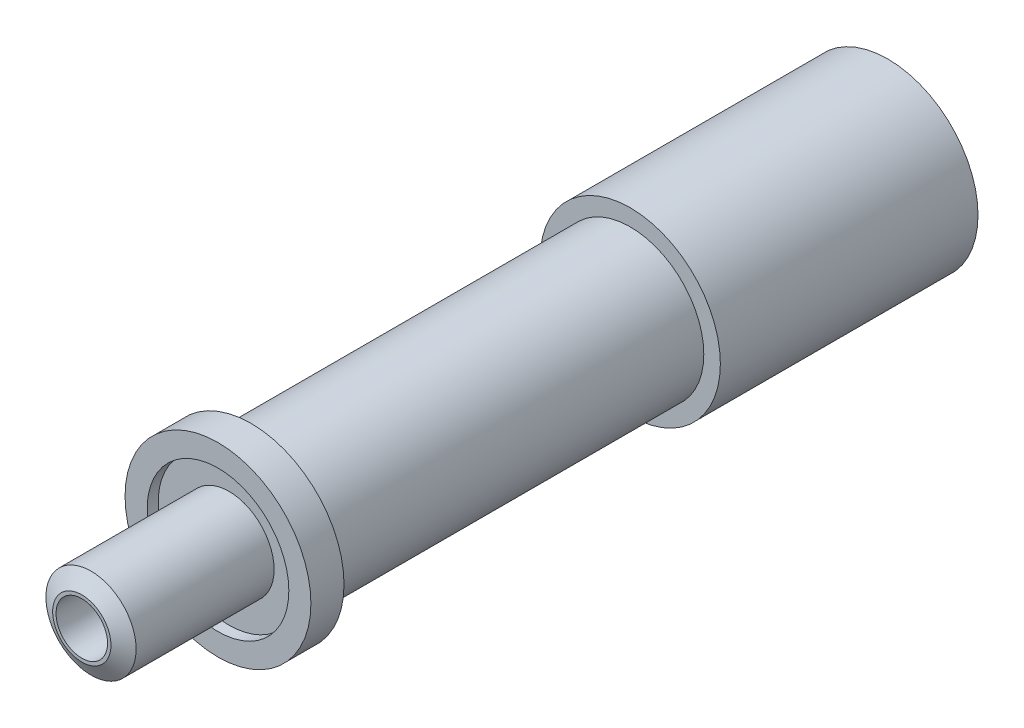
ISO-10303-21;
HEADER;
FILE_DESCRIPTION(('STEP AP214'),'2;1');
FILE_NAME('part.step','',(''),(''),'','','');
FILE_SCHEMA(('AUTOMOTIVE_DESIGN { 1 0 10303 214 1 1 1 1 }'));
ENDSEC;
DATA;
#1=APPLICATION_CONTEXT('core data for automotive mechanical design processes');
#2=APPLICATION_PROTOCOL_DEFINITION('international standard','automotive_design',2000,#1);
#3=PRODUCT_CONTEXT('',#1,'mechanical');
#4=PRODUCT('Part','Part','',(#3));
#5=PRODUCT_RELATED_PRODUCT_CATEGORY('part','',(#4));
#6=PRODUCT_DEFINITION_FORMATION('','',#4);
#7=PRODUCT_DEFINITION_CONTEXT('part definition',#1,'design');
#8=PRODUCT_DEFINITION('design','',#6,#7);
#9=PRODUCT_DEFINITION_SHAPE('','',#8);
#10=(LENGTH_UNIT() NAMED_UNIT(*) SI_UNIT(.MILLI.,.METRE.));
#11=(NAMED_UNIT(*) PLANE_ANGLE_UNIT() SI_UNIT($,.RADIAN.));
#12=(NAMED_UNIT(*) SI_UNIT($,.STERADIAN.) SOLID_ANGLE_UNIT());
#13=UNCERTAINTY_MEASURE_WITH_UNIT(LENGTH_MEASURE(1.E-05),#10,'distance_accuracy_value','');
#14=(GEOMETRIC_REPRESENTATION_CONTEXT(3) GLOBAL_UNCERTAINTY_ASSIGNED_CONTEXT((#13)) GLOBAL_UNIT_ASSIGNED_CONTEXT((#10,
#11,#12)) REPRESENTATION_CONTEXT('',''));
#15=CARTESIAN_POINT('',(0.,0.,0.));
#16=DIRECTION('',(0.,0.,1.));
#17=DIRECTION('',(1.,0.,0.));
#18=AXIS2_PLACEMENT_3D('',#15,#16,#17);
#19=CARTESIAN_POINT('',(0.,0.,-10.1));
#20=DIRECTION('',(0.,0.,1.));
#21=DIRECTION('',(1.,0.,0.));
#22=AXIS2_PLACEMENT_3D('',#19,#20,#21);
#23=PLANE('',#22);
#24=CARTESIAN_POINT('',(0.,0.,-10.1));
#25=DIRECTION('',(0.,0.,1.));
#26=DIRECTION('',(1.,0.,0.));
#27=AXIS2_PLACEMENT_3D('',#24,#25,#26);
#28=CIRCLE('',#27,0.6);
#29=CARTESIAN_POINT('',(0.6,0.,-10.1));
#30=VERTEX_POINT('',#29);
#31=EDGE_CURVE('E10',#30,#30,#28,.T.);
#32=ORIENTED_EDGE('',*,*,#31,.T.);
#33=EDGE_LOOP('',(#32));
#34=FACE_BOUND('',#33,.T.);
#35=ADVANCED_FACE('F32',(#34),#23,.T.);
#36=CARTESIAN_POINT('',(0.,0.,-10.1));
#37=DIRECTION('',(0.,0.,1.));
#38=DIRECTION('',(1.,0.,0.));
#39=AXIS2_PLACEMENT_3D('',#36,#37,#38);
#40=CONICAL_SURFACE('',#39,0.6,0.0142847425873965);
#41=CARTESIAN_POINT('',(0.,0.,-3.1));
#42=DIRECTION('',(0.,0.,1.));
#43=DIRECTION('',(1.,0.,0.));
#44=AXIS2_PLACEMENT_3D('',#41,#42,#43);
#45=CIRCLE('',#44,0.699999999999999);
#46=CARTESIAN_POINT('',(0.699999999999999,0.,-3.1));
#47=VERTEX_POINT('',#46);
#48=EDGE_CURVE('E39',#47,#47,#45,.T.);
#49=ORIENTED_EDGE('',*,*,#48,.T.);
#50=EDGE_LOOP('',(#49));
#51=FACE_BOUND('',#50,.T.);
#52=ORIENTED_EDGE('',*,*,#31,.F.);
#53=EDGE_LOOP('',(#52));
#54=FACE_BOUND('',#53,.T.);
#55=ADVANCED_FACE('F95',(#51,#54),#40,.F.);
#56=CARTESIAN_POINT('',(0.699999999999999,0.,-3.1));
#57=DIRECTION('',(0.,0.,1.));
#58=DIRECTION('',(1.,0.,0.));
#59=AXIS2_PLACEMENT_3D('',#56,#57,#58);
#60=PLANE('',#59);
#61=CARTESIAN_POINT('',(0.,0.,-3.1));
#62=DIRECTION('',(0.,0.,1.));
#63=DIRECTION('',(1.,0.,0.));
#64=AXIS2_PLACEMENT_3D('',#61,#62,#63);
#65=CIRCLE('',#64,0.7919748697619);
#66=CARTESIAN_POINT('',(0.7919748697619,0.,-3.1));
#67=VERTEX_POINT('',#66);
#68=EDGE_CURVE('E43',#67,#67,#65,.T.);
#69=ORIENTED_EDGE('',*,*,#68,.T.);
#70=EDGE_LOOP('',(#69));
#71=FACE_BOUND('',#70,.T.);
#72=ORIENTED_EDGE('',*,*,#48,.F.);
#73=EDGE_LOOP('',(#72));
#74=FACE_BOUND('',#73,.T.);
#75=ADVANCED_FACE('F99',(#71,#74),#60,.T.);
#76=CARTESIAN_POINT('',(0.,0.,-3.1));
#77=DIRECTION('',(0.,0.,-1.));
#78=DIRECTION('',(-1.,0.,0.));
#79=AXIS2_PLACEMENT_3D('',#76,#77,#78);
#80=CONICAL_SURFACE('',#79,0.7919748697619,1.0471907560184);
#81=CARTESIAN_POINT('',(0.,0.,-3.3500110988348));
#82=DIRECTION('',(0.,0.,1.));
#83=DIRECTION('',(1.,0.,0.));
#84=AXIS2_PLACEMENT_3D('',#81,#82,#83);
#85=CIRCLE('',#84,1.225);
#86=CARTESIAN_POINT('',(1.225,0.,-3.3500110988348));
#87=VERTEX_POINT('',#86);
#88=EDGE_CURVE('E47',#87,#87,#85,.T.);
#89=ORIENTED_EDGE('',*,*,#88,.T.);
#90=EDGE_LOOP('',(#89));
#91=FACE_BOUND('',#90,.T.);
#92=ORIENTED_EDGE('',*,*,#68,.F.);
#93=EDGE_LOOP('',(#92));
#94=FACE_BOUND('',#93,.T.);
#95=ADVANCED_FACE('F104',(#91,#94),#80,.T.);
#96=CARTESIAN_POINT('',(0.,0.,-25.5));
#97=DIRECTION('',(0.,0.,1.));
#98=DIRECTION('',(1.,0.,0.));
#99=AXIS2_PLACEMENT_3D('',#96,#97,#98);
#100=CYLINDRICAL_SURFACE('',#99,1.225);
#101=CARTESIAN_POINT('',(0.,0.,-7.1));
#102=DIRECTION('',(0.,0.,1.));
#103=DIRECTION('',(1.,0.,0.));
#104=AXIS2_PLACEMENT_3D('',#101,#102,#103);
#105=CIRCLE('',#104,1.225);
#106=CARTESIAN_POINT('',(1.225,0.,-7.1));
#107=VERTEX_POINT('',#106);
#108=EDGE_CURVE('E52',#107,#107,#105,.T.);
#109=ORIENTED_EDGE('',*,*,#108,.T.);
#110=EDGE_LOOP('',(#109));
#111=FACE_BOUND('',#110,.T.);
#112=ORIENTED_EDGE('',*,*,#88,.F.);
#113=EDGE_LOOP('',(#112));
#114=FACE_BOUND('',#113,.T.);
#115=ADVANCED_FACE('F108',(#111,#114),#100,.T.);
#116=CARTESIAN_POINT('',(1.225,0.,-7.1));
#117=DIRECTION('',(0.,0.,1.));
#118=DIRECTION('',(1.,0.,0.));
#119=AXIS2_PLACEMENT_3D('',#116,#117,#118);
#120=PLANE('',#119);
#121=CARTESIAN_POINT('',(0.,0.,-7.1));
#122=DIRECTION('',(0.,0.,1.));
#123=DIRECTION('',(1.,0.,0.));
#124=AXIS2_PLACEMENT_3D('',#121,#122,#123);
#125=CIRCLE('',#124,1.925);
#126=CARTESIAN_POINT('',(1.925,0.,-7.1));
#127=VERTEX_POINT('',#126);
#128=EDGE_CURVE('E55',#127,#127,#125,.T.);
#129=ORIENTED_EDGE('',*,*,#128,.T.);
#130=EDGE_LOOP('',(#129));
#131=FACE_BOUND('',#130,.T.);
#132=ORIENTED_EDGE('',*,*,#108,.F.);
#133=EDGE_LOOP('',(#132));
#134=FACE_BOUND('',#133,.T.);
#135=ADVANCED_FACE('F112',(#131,#134),#120,.T.);
#136=CARTESIAN_POINT('',(0.,0.,-25.5));
#137=DIRECTION('',(0.,0.,1.));
#138=DIRECTION('',(1.,0.,0.));
#139=AXIS2_PLACEMENT_3D('',#136,#137,#138);
#140=CYLINDRICAL_SURFACE('',#139,1.925);
#141=CARTESIAN_POINT('',(0.,0.,-6.8));
#142=DIRECTION('',(0.,0.,1.));
#143=DIRECTION('',(1.,0.,0.));
#144=AXIS2_PLACEMENT_3D('',#141,#142,#143);
#145=CIRCLE('',#144,1.925);
#146=CARTESIAN_POINT('',(1.925,0.,-6.8));
#147=VERTEX_POINT('',#146);
#148=EDGE_CURVE('E58',#147,#147,#145,.T.);
#149=ORIENTED_EDGE('',*,*,#148,.T.);
#150=EDGE_LOOP('',(#149));
#151=FACE_BOUND('',#150,.T.);
#152=ORIENTED_EDGE('',*,*,#128,.F.);
#153=EDGE_LOOP('',(#152));
#154=FACE_BOUND('',#153,.T.);
#155=ADVANCED_FACE('F116',(#151,#154),#140,.F.);
#156=CARTESIAN_POINT('',(1.925,0.,-6.8));
#157=DIRECTION('',(0.,0.,1.));
#158=DIRECTION('',(1.,0.,0.));
#159=AXIS2_PLACEMENT_3D('',#156,#157,#158);
#160=PLANE('',#159);
#161=CARTESIAN_POINT('',(0.,0.,-6.8));
#162=DIRECTION('',(0.,0.,1.));
#163=DIRECTION('',(1.,0.,0.));
#164=AXIS2_PLACEMENT_3D('',#161,#162,#163);
#165=CIRCLE('',#164,2.525);
#166=CARTESIAN_POINT('',(2.525,0.,-6.8));
#167=VERTEX_POINT('',#166);
#168=EDGE_CURVE('E61',#167,#167,#165,.T.);
#169=ORIENTED_EDGE('',*,*,#168,.T.);
#170=EDGE_LOOP('',(#169));
#171=FACE_BOUND('',#170,.T.);
#172=ORIENTED_EDGE('',*,*,#148,.F.);
#173=EDGE_LOOP('',(#172));
#174=FACE_BOUND('',#173,.T.);
#175=ADVANCED_FACE('F120',(#171,#174),#160,.T.);
#176=CARTESIAN_POINT('',(0.,0.,-25.5));
#177=DIRECTION('',(0.,0.,1.));
#178=DIRECTION('',(1.,0.,0.));
#179=AXIS2_PLACEMENT_3D('',#176,#177,#178);
#180=CYLINDRICAL_SURFACE('',#179,2.525);
#181=CARTESIAN_POINT('',(0.,0.,-7.7));
#182=DIRECTION('',(0.,0.,1.));
#183=DIRECTION('',(1.,0.,0.));
#184=AXIS2_PLACEMENT_3D('',#181,#182,#183);
#185=CIRCLE('',#184,2.525);
#186=CARTESIAN_POINT('',(2.525,0.,-7.7));
#187=VERTEX_POINT('',#186);
#188=EDGE_CURVE('E64',#187,#187,#185,.T.);
#189=ORIENTED_EDGE('',*,*,#188,.T.);
#190=EDGE_LOOP('',(#189));
#191=FACE_BOUND('',#190,.T.);
#192=ORIENTED_EDGE('',*,*,#168,.F.);
#193=EDGE_LOOP('',(#192));
#194=FACE_BOUND('',#193,.T.);
#195=ADVANCED_FACE('F124',(#191,#194),#180,.T.);
#196=CARTESIAN_POINT('',(2.525,0.,-7.7));
#197=DIRECTION('',(0.,0.,-1.));
#198=DIRECTION('',(-1.,0.,0.));
#199=AXIS2_PLACEMENT_3D('',#196,#197,#198);
#200=PLANE('',#199);
#201=CARTESIAN_POINT('',(0.,0.,-7.7));
#202=DIRECTION('',(0.,0.,1.));
#203=DIRECTION('',(1.,0.,0.));
#204=AXIS2_PLACEMENT_3D('',#201,#202,#203);
#205=CIRCLE('',#204,2.);
#206=CARTESIAN_POINT('',(2.,0.,-7.7));
#207=VERTEX_POINT('',#206);
#208=EDGE_CURVE('E67',#207,#207,#205,.T.);
#209=ORIENTED_EDGE('',*,*,#208,.T.);
#210=EDGE_LOOP('',(#209));
#211=FACE_BOUND('',#210,.T.);
#212=ORIENTED_EDGE('',*,*,#188,.F.);
#213=EDGE_LOOP('',(#212));
#214=FACE_BOUND('',#213,.T.);
#215=ADVANCED_FACE('F128',(#211,#214),#200,.T.);
#216=CARTESIAN_POINT('',(0.,0.,-25.5));
#217=DIRECTION('',(0.,0.,1.));
#218=DIRECTION('',(1.,0.,0.));
#219=AXIS2_PLACEMENT_3D('',#216,#217,#218);
#220=CYLINDRICAL_SURFACE('',#219,2.);
#221=CARTESIAN_POINT('',(0.,0.,-18.));
#222=DIRECTION('',(0.,0.,1.));
#223=DIRECTION('',(1.,0.,0.));
#224=AXIS2_PLACEMENT_3D('',#221,#222,#223);
#225=CIRCLE('',#224,2.);
#226=CARTESIAN_POINT('',(2.,0.,-18.));
#227=VERTEX_POINT('',#226);
#228=EDGE_CURVE('E70',#227,#227,#225,.T.);
#229=ORIENTED_EDGE('',*,*,#228,.T.);
#230=EDGE_LOOP('',(#229));
#231=FACE_BOUND('',#230,.T.);
#232=ORIENTED_EDGE('',*,*,#208,.F.);
#233=EDGE_LOOP('',(#232));
#234=FACE_BOUND('',#233,.T.);
#235=ADVANCED_FACE('F90',(#231,#234),#220,.T.);
#236=CARTESIAN_POINT('',(2.,0.,-18.));
#237=DIRECTION('',(0.,0.,1.));
#238=DIRECTION('',(1.,0.,0.));
#239=AXIS2_PLACEMENT_3D('',#236,#237,#238);
#240=PLANE('',#239);
#241=CARTESIAN_POINT('',(0.,0.,-18.));
#242=DIRECTION('',(0.,0.,1.));
#243=DIRECTION('',(1.,0.,0.));
#244=AXIS2_PLACEMENT_3D('',#241,#242,#243);
#245=CIRCLE('',#244,2.45);
#246=CARTESIAN_POINT('',(2.45,0.,-18.));
#247=VERTEX_POINT('',#246);
#248=EDGE_CURVE('E73',#247,#247,#245,.T.);
#249=ORIENTED_EDGE('',*,*,#248,.T.);
#250=EDGE_LOOP('',(#249));
#251=FACE_BOUND('',#250,.T.);
#252=ORIENTED_EDGE('',*,*,#228,.F.);
#253=EDGE_LOOP('',(#252));
#254=FACE_BOUND('',#253,.T.);
#255=ADVANCED_FACE('F83',(#251,#254),#240,.T.);
#256=CARTESIAN_POINT('',(0.,0.,-25.5));
#257=DIRECTION('',(0.,0.,1.));
#258=DIRECTION('',(1.,0.,0.));
#259=AXIS2_PLACEMENT_3D('',#256,#257,#258);
#260=CYLINDRICAL_SURFACE('',#259,2.45);
#261=ORIENTED_EDGE('',*,*,#248,.F.);
#262=EDGE_LOOP('',(#261));
#263=FACE_BOUND('',#262,.T.);
#264=CARTESIAN_POINT('',(0.,0.,-25.0000906848284));
#265=DIRECTION('',(0.,0.,-1.));
#266=DIRECTION('',(-1.,0.,0.));
#267=AXIS2_PLACEMENT_3D('',#264,#265,#266);
#268=CIRCLE('',#267,2.45);
#269=CARTESIAN_POINT('',(-2.45,0.,-25.0000906848284));
#270=VERTEX_POINT('',#269);
#271=EDGE_CURVE('E76',#270,#270,#268,.T.);
#272=ORIENTED_EDGE('',*,*,#271,.F.);
#273=EDGE_LOOP('',(#272));
#274=FACE_BOUND('',#273,.T.);
#275=ADVANCED_FACE('F81',(#263,#274),#260,.T.);
#276=CARTESIAN_POINT('',(0.,0.,-38.78404875209));
#277=DIRECTION('',(0.,0.,1.));
#278=DIRECTION('',(1.,0.,0.));
#279=AXIS2_PLACEMENT_3D('',#276,#277,#278);
#280=SPHERICAL_SURFACE('',#279,14.0000000000009);
#281=ORIENTED_EDGE('',*,*,#271,.T.);
#282=EDGE_LOOP('',(#281));
#283=FACE_BOUND('',#282,.T.);
#284=ADVANCED_FACE('F34',(#283),#280,.F.);
#285=CLOSED_SHELL('',(#35,#55,#75,#95,#115,#135,#155,#175,#195,#215,#235,#255,#275,#284));
#286=MANIFOLD_SOLID_BREP('B2',#285);
#287=ADVANCED_BREP_SHAPE_REPRESENTATION('',(#18,#286),#14);
#288=SHAPE_DEFINITION_REPRESENTATION(#9,#287);
ENDSEC;
END-ISO-10303-21;
